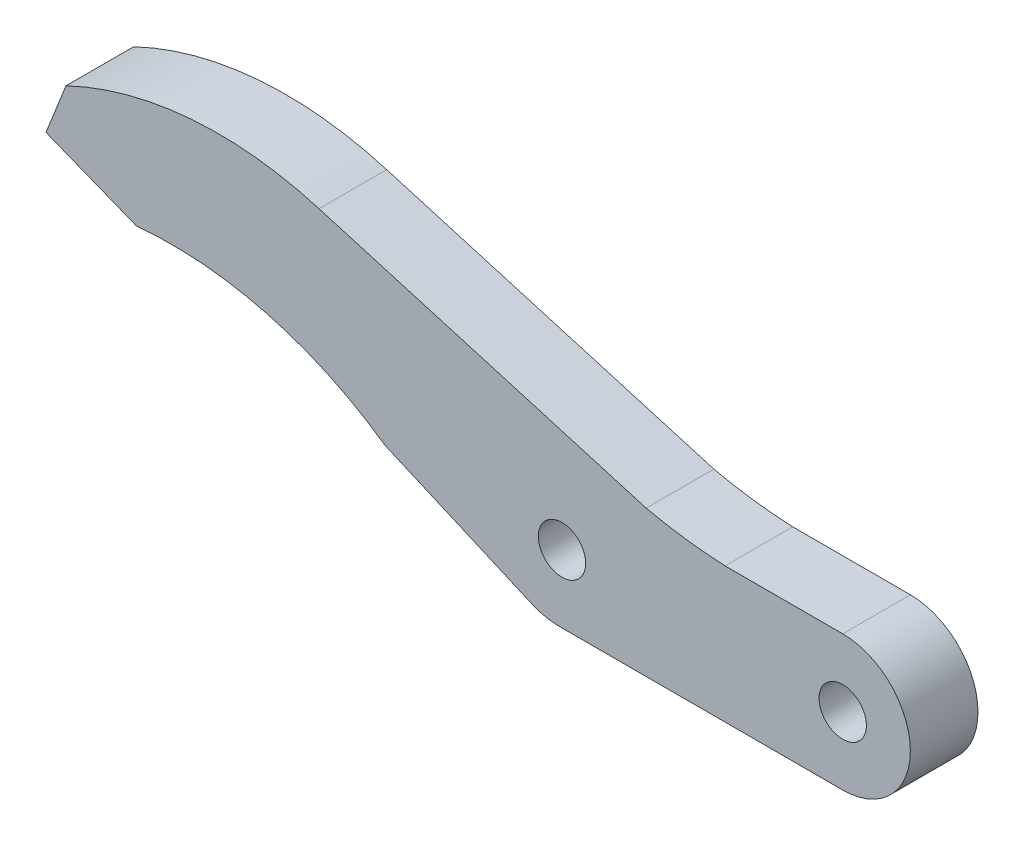
ISO-10303-21;
HEADER;
FILE_DESCRIPTION(('STEP AP214'),'2;1');
FILE_NAME('part.step','',(''),(''),'','','');
FILE_SCHEMA(('AUTOMOTIVE_DESIGN { 1 0 10303 214 1 1 1 1 }'));
ENDSEC;
DATA;
#1=APPLICATION_CONTEXT('core data for automotive mechanical design processes');
#2=APPLICATION_PROTOCOL_DEFINITION('international standard','automotive_design',2000,#1);
#3=PRODUCT_CONTEXT('',#1,'mechanical');
#4=PRODUCT('Part','Part','',(#3));
#5=PRODUCT_RELATED_PRODUCT_CATEGORY('part','',(#4));
#6=PRODUCT_DEFINITION_FORMATION('','',#4);
#7=PRODUCT_DEFINITION_CONTEXT('part definition',#1,'design');
#8=PRODUCT_DEFINITION('design','',#6,#7);
#9=PRODUCT_DEFINITION_SHAPE('','',#8);
#10=(LENGTH_UNIT() NAMED_UNIT(*) SI_UNIT(.MILLI.,.METRE.));
#11=(NAMED_UNIT(*) PLANE_ANGLE_UNIT() SI_UNIT($,.RADIAN.));
#12=(NAMED_UNIT(*) SI_UNIT($,.STERADIAN.) SOLID_ANGLE_UNIT());
#13=UNCERTAINTY_MEASURE_WITH_UNIT(LENGTH_MEASURE(1.E-05),#10,'distance_accuracy_value','');
#14=(GEOMETRIC_REPRESENTATION_CONTEXT(3) GLOBAL_UNCERTAINTY_ASSIGNED_CONTEXT((#13)) GLOBAL_UNIT_ASSIGNED_CONTEXT((#10,
#11,#12)) REPRESENTATION_CONTEXT('',''));
#15=CARTESIAN_POINT('',(0.,0.,0.));
#16=DIRECTION('',(0.,0.,1.));
#17=DIRECTION('',(1.,0.,0.));
#18=AXIS2_PLACEMENT_3D('',#15,#16,#17);
#19=CARTESIAN_POINT('',(-49.5655009596438,-22.2319264601483,5.));
#20=DIRECTION('',(0.,0.,1.));
#21=DIRECTION('',(1.,0.,0.));
#22=AXIS2_PLACEMENT_3D('',#19,#20,#21);
#23=PLANE('',#22);
#24=CARTESIAN_POINT('',(0.,0.,5.));
#25=DIRECTION('',(0.,0.,1.));
#26=DIRECTION('',(1.,0.,0.));
#27=AXIS2_PLACEMENT_3D('',#24,#25,#26);
#28=CIRCLE('',#27,1.74998529864571);
#29=CARTESIAN_POINT('',(1.74998529864571,0.,5.));
#30=VERTEX_POINT('',#29);
#31=EDGE_CURVE('E185',#30,#30,#28,.T.);
#32=ORIENTED_EDGE('',*,*,#31,.F.);
#33=EDGE_LOOP('',(#32));
#34=FACE_BOUND('',#33,.T.);
#35=DIRECTION('',(0.916929046835155,-0.399050276368749,0.));
#36=VECTOR('',#35,1.);
#37=CARTESIAN_POINT('',(-33.8283838458603,0.147779707769994,5.));
#38=LINE('',#37,#36);
#39=CARTESIAN_POINT('',(-33.8283838458603,0.147779707769994,5.));
#40=VERTEX_POINT('',#39);
#41=CARTESIAN_POINT('',(-22.9543922898167,-4.58461409156264,5.));
#42=VERTEX_POINT('',#41);
#43=EDGE_CURVE('E115',#40,#42,#38,.T.);
#44=ORIENTED_EDGE('',*,*,#43,.T.);
#45=CARTESIAN_POINT('',(-20.9591409079729,3.11426131299659E-05,5.));
#46=DIRECTION('',(0.,0.,1.));
#47=DIRECTION('',(1.,0.,0.));
#48=AXIS2_PLACEMENT_3D('',#45,#46,#47);
#49=CIRCLE('',#48,5.);
#50=CARTESIAN_POINT('',(-20.9591409079729,-4.99996885738687,5.));
#51=VERTEX_POINT('',#50);
#52=EDGE_CURVE('E11',#42,#51,#49,.T.);
#53=ORIENTED_EDGE('',*,*,#52,.T.);
#54=DIRECTION('',(1.,0.,0.));
#55=VECTOR('',#54,1.);
#56=CARTESIAN_POINT('',(0.,-4.99996885738687,5.));
#57=LINE('',#56,#55);
#58=CARTESIAN_POINT('',(0.,-4.99996885738687,5.));
#59=VERTEX_POINT('',#58);
#60=EDGE_CURVE('E123',#51,#59,#57,.T.);
#61=ORIENTED_EDGE('',*,*,#60,.T.);
#62=CARTESIAN_POINT('',(0.,0.,5.));
#63=DIRECTION('',(0.,0.,1.));
#64=DIRECTION('',(1.,0.,0.));
#65=AXIS2_PLACEMENT_3D('',#62,#63,#64);
#66=CIRCLE('',#65,4.99996885738686);
#67=CARTESIAN_POINT('',(0.,4.99996885738686,5.));
#68=VERTEX_POINT('',#67);
#69=EDGE_CURVE('E197',#59,#68,#66,.T.);
#70=ORIENTED_EDGE('',*,*,#69,.T.);
#71=DIRECTION('',(-1.,0.,0.));
#72=VECTOR('',#71,1.);
#73=CARTESIAN_POINT('',(0.,4.99996885738686,5.));
#74=LINE('',#73,#72);
#75=CARTESIAN_POINT('',(-8.7,4.99996885738686,5.));
#76=VERTEX_POINT('',#75);
#77=EDGE_CURVE('E195',#68,#76,#74,.T.);
#78=ORIENTED_EDGE('',*,*,#77,.T.);
#79=CARTESIAN_POINT('',(-7.15261933154449,38.5643191872665,5.));
#80=DIRECTION('',(0.,0.,-1.));
#81=DIRECTION('',(-1.,0.,0.));
#82=AXIS2_PLACEMENT_3D('',#79,#80,#81);
#83=CIRCLE('',#82,33.6);
#84=CARTESIAN_POINT('',(-14.5233264252033,5.78272866850905,5.));
#85=VERTEX_POINT('',#84);
#86=EDGE_CURVE('E193',#76,#85,#83,.T.);
#87=ORIENTED_EDGE('',*,*,#86,.T.);
#88=DIRECTION('',(-0.959759160307781,0.280824418819489,0.));
#89=VECTOR('',#88,1.);
#90=CARTESIAN_POINT('',(-38.7092572649595,12.8595040227602,5.));
#91=LINE('',#90,#89);
#92=CARTESIAN_POINT('',(-38.7092572649595,12.8595040227602,5.));
#93=VERTEX_POINT('',#92);
#94=EDGE_CURVE('E191',#85,#93,#91,.T.);
#95=ORIENTED_EDGE('',*,*,#94,.T.);
#96=CARTESIAN_POINT('',(-46.1413277586198,-12.0556385250412,5.));
#97=DIRECTION('',(0.,0.,1.));
#98=DIRECTION('',(1.,0.,0.));
#99=AXIS2_PLACEMENT_3D('',#96,#97,#98);
#100=CIRCLE('',#99,26.);
#101=CARTESIAN_POINT('',(-57.4174023013608,11.3719124119763,5.));
#102=VERTEX_POINT('',#101);
#103=EDGE_CURVE('E189',#93,#102,#100,.T.);
#104=ORIENTED_EDGE('',*,*,#103,.T.);
#105=DIRECTION('',(-0.368541423081734,-0.929611327100144,0.));
#106=VECTOR('',#105,1.);
#107=CARTESIAN_POINT('',(-58.8915679936878,7.65346710357549,5.));
#108=LINE('',#107,#106);
#109=CARTESIAN_POINT('',(-58.8915679936878,7.65346710357549,5.));
#110=VERTEX_POINT('',#109);
#111=EDGE_CURVE('E187',#102,#110,#108,.T.);
#112=ORIENTED_EDGE('',*,*,#111,.T.);
#113=DIRECTION('',(0.929611327100136,-0.368541423081754,0.));
#114=VECTOR('',#113,1.);
#115=CARTESIAN_POINT('',(-52.1983664385668,4.99996885738686,5.));
#116=LINE('',#115,#114);
#117=CARTESIAN_POINT('',(-52.1983664385668,4.99996885738686,5.));
#118=VERTEX_POINT('',#117);
#119=EDGE_CURVE('E129',#110,#118,#116,.T.);
#120=ORIENTED_EDGE('',*,*,#119,.T.);
#121=CARTESIAN_POINT('',(-49.5655009596438,-22.2319264601483,5.));
#122=DIRECTION('',(0.,0.,-1.));
#123=DIRECTION('',(1.,0.,0.));
#124=AXIS2_PLACEMENT_3D('',#121,#122,#123);
#125=CIRCLE('',#124,27.3588761321678);
#126=EDGE_CURVE('E124',#118,#40,#125,.T.);
#127=ORIENTED_EDGE('',*,*,#126,.T.);
#128=EDGE_LOOP('',(#44,#53,#61,#70,#78,#87,#95,#104,#112,#120,#127));
#129=FACE_BOUND('',#128,.T.);
#130=CARTESIAN_POINT('',(-20.75,0.,5.));
#131=DIRECTION('',(0.,0.,1.));
#132=DIRECTION('',(1.,0.,0.));
#133=AXIS2_PLACEMENT_3D('',#130,#131,#132);
#134=CIRCLE('',#133,1.75);
#135=CARTESIAN_POINT('',(-19.,0.,5.));
#136=VERTEX_POINT('',#135);
#137=EDGE_CURVE('E203',#136,#136,#134,.T.);
#138=ORIENTED_EDGE('',*,*,#137,.F.);
#139=EDGE_LOOP('',(#138));
#140=FACE_BOUND('',#139,.T.);
#141=ADVANCED_FACE('F36',(#34,#129,#140),#23,.T.);
#142=CARTESIAN_POINT('',(-49.5655009596438,-22.2319264601483,0.));
#143=DIRECTION('',(0.,0.,1.));
#144=DIRECTION('',(1.,0.,0.));
#145=AXIS2_PLACEMENT_3D('',#142,#143,#144);
#146=PLANE('',#145);
#147=DIRECTION('',(1.,0.,0.));
#148=VECTOR('',#147,1.);
#149=CARTESIAN_POINT('',(0.,-4.99996885738687,0.));
#150=LINE('',#149,#148);
#151=CARTESIAN_POINT('',(-20.9591409079729,-4.99996885738687,0.));
#152=VERTEX_POINT('',#151);
#153=CARTESIAN_POINT('',(0.,-4.99996885738687,0.));
#154=VERTEX_POINT('',#153);
#155=EDGE_CURVE('E180',#152,#154,#150,.T.);
#156=ORIENTED_EDGE('',*,*,#155,.F.);
#157=CARTESIAN_POINT('',(-20.9591409079729,3.11426131299659E-05,0.));
#158=DIRECTION('',(0.,0.,1.));
#159=DIRECTION('',(1.,0.,0.));
#160=AXIS2_PLACEMENT_3D('',#157,#158,#159);
#161=CIRCLE('',#160,5.);
#162=CARTESIAN_POINT('',(-22.9543922898167,-4.58461409156264,0.));
#163=VERTEX_POINT('',#162);
#164=EDGE_CURVE('E58',#152,#163,#161,.F.);
#165=ORIENTED_EDGE('',*,*,#164,.T.);
#166=DIRECTION('',(0.916929046835155,-0.399050276368749,0.));
#167=VECTOR('',#166,1.);
#168=CARTESIAN_POINT('',(-33.8283838458603,0.147779707769994,0.));
#169=LINE('',#168,#167);
#170=CARTESIAN_POINT('',(-33.8283838458603,0.147779707769994,0.));
#171=VERTEX_POINT('',#170);
#172=EDGE_CURVE('E182',#171,#163,#169,.T.);
#173=ORIENTED_EDGE('',*,*,#172,.F.);
#174=CARTESIAN_POINT('',(-49.5655009596438,-22.2319264601483,0.));
#175=DIRECTION('',(0.,0.,-1.));
#176=DIRECTION('',(1.,0.,0.));
#177=AXIS2_PLACEMENT_3D('',#174,#175,#176);
#178=CIRCLE('',#177,27.3588761321678);
#179=CARTESIAN_POINT('',(-52.1983664385668,4.99996885738686,0.));
#180=VERTEX_POINT('',#179);
#181=EDGE_CURVE('E137',#180,#171,#178,.T.);
#182=ORIENTED_EDGE('',*,*,#181,.F.);
#183=DIRECTION('',(0.929611327100136,-0.368541423081754,0.));
#184=VECTOR('',#183,1.);
#185=CARTESIAN_POINT('',(-52.1983664385668,4.99996885738686,0.));
#186=LINE('',#185,#184);
#187=CARTESIAN_POINT('',(-58.8915679936878,7.65346710357549,0.));
#188=VERTEX_POINT('',#187);
#189=EDGE_CURVE('E133',#188,#180,#186,.T.);
#190=ORIENTED_EDGE('',*,*,#189,.F.);
#191=DIRECTION('',(-0.368541423081734,-0.929611327100144,0.));
#192=VECTOR('',#191,1.);
#193=CARTESIAN_POINT('',(-58.8915679936878,7.65346710357549,0.));
#194=LINE('',#193,#192);
#195=CARTESIAN_POINT('',(-57.4174023013608,11.3719124119763,0.));
#196=VERTEX_POINT('',#195);
#197=EDGE_CURVE('E168',#196,#188,#194,.T.);
#198=ORIENTED_EDGE('',*,*,#197,.F.);
#199=CARTESIAN_POINT('',(-46.1413277586198,-12.0556385250412,0.));
#200=DIRECTION('',(0.,0.,1.));
#201=DIRECTION('',(1.,0.,0.));
#202=AXIS2_PLACEMENT_3D('',#199,#200,#201);
#203=CIRCLE('',#202,26.);
#204=CARTESIAN_POINT('',(-38.7092572649595,12.8595040227602,0.));
#205=VERTEX_POINT('',#204);
#206=EDGE_CURVE('E170',#205,#196,#203,.T.);
#207=ORIENTED_EDGE('',*,*,#206,.F.);
#208=DIRECTION('',(-0.959759160307781,0.280824418819489,0.));
#209=VECTOR('',#208,1.);
#210=CARTESIAN_POINT('',(-38.7092572649595,12.8595040227602,0.));
#211=LINE('',#210,#209);
#212=CARTESIAN_POINT('',(-14.5233264252033,5.78272866850905,0.));
#213=VERTEX_POINT('',#212);
#214=EDGE_CURVE('E172',#213,#205,#211,.T.);
#215=ORIENTED_EDGE('',*,*,#214,.F.);
#216=CARTESIAN_POINT('',(-7.15261933154449,38.5643191872665,0.));
#217=DIRECTION('',(0.,0.,-1.));
#218=DIRECTION('',(-1.,0.,0.));
#219=AXIS2_PLACEMENT_3D('',#216,#217,#218);
#220=CIRCLE('',#219,33.6);
#221=CARTESIAN_POINT('',(-8.7,4.99996885738686,0.));
#222=VERTEX_POINT('',#221);
#223=EDGE_CURVE('E174',#222,#213,#220,.T.);
#224=ORIENTED_EDGE('',*,*,#223,.F.);
#225=DIRECTION('',(-1.,0.,0.));
#226=VECTOR('',#225,1.);
#227=CARTESIAN_POINT('',(0.,4.99996885738686,0.));
#228=LINE('',#227,#226);
#229=CARTESIAN_POINT('',(0.,4.99996885738686,0.));
#230=VERTEX_POINT('',#229);
#231=EDGE_CURVE('E176',#230,#222,#228,.T.);
#232=ORIENTED_EDGE('',*,*,#231,.F.);
#233=CARTESIAN_POINT('',(0.,0.,0.));
#234=DIRECTION('',(0.,0.,1.));
#235=DIRECTION('',(1.,0.,0.));
#236=AXIS2_PLACEMENT_3D('',#233,#234,#235);
#237=CIRCLE('',#236,4.99996885738686);
#238=EDGE_CURVE('E178',#154,#230,#237,.T.);
#239=ORIENTED_EDGE('',*,*,#238,.F.);
#240=EDGE_LOOP('',(#156,#165,#173,#182,#190,#198,#207,#215,#224,#232,#239));
#241=FACE_BOUND('',#240,.T.);
#242=CARTESIAN_POINT('',(0.,0.,0.));
#243=DIRECTION('',(0.,0.,1.));
#244=DIRECTION('',(1.,0.,0.));
#245=AXIS2_PLACEMENT_3D('',#242,#243,#244);
#246=CIRCLE('',#245,1.74998529864571);
#247=CARTESIAN_POINT('',(1.74998529864571,0.,0.));
#248=VERTEX_POINT('',#247);
#249=EDGE_CURVE('E200',#248,#248,#246,.T.);
#250=ORIENTED_EDGE('',*,*,#249,.T.);
#251=EDGE_LOOP('',(#250));
#252=FACE_BOUND('',#251,.T.);
#253=CARTESIAN_POINT('',(-20.75,0.,0.));
#254=DIRECTION('',(0.,0.,1.));
#255=DIRECTION('',(1.,0.,0.));
#256=AXIS2_PLACEMENT_3D('',#253,#254,#255);
#257=CIRCLE('',#256,1.75);
#258=CARTESIAN_POINT('',(-19.,0.,0.));
#259=VERTEX_POINT('',#258);
#260=EDGE_CURVE('E206',#259,#259,#257,.T.);
#261=ORIENTED_EDGE('',*,*,#260,.T.);
#262=EDGE_LOOP('',(#261));
#263=FACE_BOUND('',#262,.T.);
#264=ADVANCED_FACE('F215',(#241,#252,#263),#146,.F.);
#265=CARTESIAN_POINT('',(-49.5655009596438,-22.2319264601483,5.));
#266=DIRECTION('',(0.,0.,-1.));
#267=DIRECTION('',(-1.,0.,0.));
#268=AXIS2_PLACEMENT_3D('',#265,#266,#267);
#269=CYLINDRICAL_SURFACE('',#268,27.3588761321678);
#270=ORIENTED_EDGE('',*,*,#181,.T.);
#271=DIRECTION('',(0.,0.,-1.));
#272=VECTOR('',#271,1.);
#273=CARTESIAN_POINT('',(-33.8283838458603,0.147779707769994,5.));
#274=LINE('',#273,#272);
#275=EDGE_CURVE('E119',#40,#171,#274,.T.);
#276=ORIENTED_EDGE('',*,*,#275,.F.);
#277=ORIENTED_EDGE('',*,*,#126,.F.);
#278=DIRECTION('',(0.,0.,-1.));
#279=VECTOR('',#278,1.);
#280=CARTESIAN_POINT('',(-52.1983664385668,4.99996885738686,5.));
#281=LINE('',#280,#279);
#282=EDGE_CURVE('E165',#118,#180,#281,.T.);
#283=ORIENTED_EDGE('',*,*,#282,.T.);
#284=EDGE_LOOP('',(#270,#276,#277,#283));
#285=FACE_BOUND('',#284,.T.);
#286=ADVANCED_FACE('F135',(#285),#269,.F.);
#287=CARTESIAN_POINT('',(-33.8283838458603,0.147779707769994,5.));
#288=DIRECTION('',(0.399050276368749,0.916929046835155,0.));
#289=DIRECTION('',(-0.916929046835155,0.399050276368749,0.));
#290=AXIS2_PLACEMENT_3D('',#287,#288,#289);
#291=PLANE('',#290);
#292=ORIENTED_EDGE('',*,*,#172,.T.);
#293=DIRECTION('',(0.,0.,-1.));
#294=VECTOR('',#293,1.);
#295=CARTESIAN_POINT('',(-22.9543922898167,-4.58461409156264,5.));
#296=LINE('',#295,#294);
#297=EDGE_CURVE('E44',#163,#42,#296,.F.);
#298=ORIENTED_EDGE('',*,*,#297,.T.);
#299=ORIENTED_EDGE('',*,*,#43,.F.);
#300=ORIENTED_EDGE('',*,*,#275,.T.);
#301=EDGE_LOOP('',(#292,#298,#299,#300));
#302=FACE_BOUND('',#301,.T.);
#303=ADVANCED_FACE('F117',(#302),#291,.F.);
#304=CARTESIAN_POINT('',(0.,-4.99996885738687,5.));
#305=DIRECTION('',(0.,1.,0.));
#306=DIRECTION('',(-1.,0.,0.));
#307=AXIS2_PLACEMENT_3D('',#304,#305,#306);
#308=PLANE('',#307);
#309=ORIENTED_EDGE('',*,*,#60,.F.);
#310=DIRECTION('',(0.,0.,-1.));
#311=VECTOR('',#310,1.);
#312=CARTESIAN_POINT('',(-20.9591409079729,-4.99996885738687,5.));
#313=LINE('',#312,#311);
#314=EDGE_CURVE('E138',#51,#152,#313,.T.);
#315=ORIENTED_EDGE('',*,*,#314,.T.);
#316=ORIENTED_EDGE('',*,*,#155,.T.);
#317=DIRECTION('',(0.,0.,-1.));
#318=VECTOR('',#317,1.);
#319=CARTESIAN_POINT('',(0.,-4.99996885738687,5.));
#320=LINE('',#319,#318);
#321=EDGE_CURVE('E139',#59,#154,#320,.T.);
#322=ORIENTED_EDGE('',*,*,#321,.F.);
#323=EDGE_LOOP('',(#309,#315,#316,#322));
#324=FACE_BOUND('',#323,.T.);
#325=ADVANCED_FACE('F254',(#324),#308,.F.);
#326=CARTESIAN_POINT('',(0.,0.,5.));
#327=DIRECTION('',(0.,0.,-1.));
#328=DIRECTION('',(-1.,0.,0.));
#329=AXIS2_PLACEMENT_3D('',#326,#327,#328);
#330=CYLINDRICAL_SURFACE('',#329,4.99996885738686);
#331=ORIENTED_EDGE('',*,*,#238,.T.);
#332=DIRECTION('',(0.,0.,-1.));
#333=VECTOR('',#332,1.);
#334=CARTESIAN_POINT('',(0.,4.99996885738686,5.));
#335=LINE('',#334,#333);
#336=EDGE_CURVE('E144',#68,#230,#335,.T.);
#337=ORIENTED_EDGE('',*,*,#336,.F.);
#338=ORIENTED_EDGE('',*,*,#69,.F.);
#339=ORIENTED_EDGE('',*,*,#321,.T.);
#340=EDGE_LOOP('',(#331,#337,#338,#339));
#341=FACE_BOUND('',#340,.T.);
#342=ADVANCED_FACE('F250',(#341),#330,.T.);
#343=CARTESIAN_POINT('',(0.,4.99996885738686,5.));
#344=DIRECTION('',(0.,-1.,0.));
#345=DIRECTION('',(1.,0.,0.));
#346=AXIS2_PLACEMENT_3D('',#343,#344,#345);
#347=PLANE('',#346);
#348=ORIENTED_EDGE('',*,*,#231,.T.);
#349=DIRECTION('',(0.,0.,-1.));
#350=VECTOR('',#349,1.);
#351=CARTESIAN_POINT('',(-8.7,4.99996885738686,5.));
#352=LINE('',#351,#350);
#353=EDGE_CURVE('E150',#76,#222,#352,.T.);
#354=ORIENTED_EDGE('',*,*,#353,.F.);
#355=ORIENTED_EDGE('',*,*,#77,.F.);
#356=ORIENTED_EDGE('',*,*,#336,.T.);
#357=EDGE_LOOP('',(#348,#354,#355,#356));
#358=FACE_BOUND('',#357,.T.);
#359=ADVANCED_FACE('F246',(#358),#347,.F.);
#360=CARTESIAN_POINT('',(-7.15261933154449,38.5643191872665,5.));
#361=DIRECTION('',(0.,0.,-1.));
#362=DIRECTION('',(-1.,0.,0.));
#363=AXIS2_PLACEMENT_3D('',#360,#361,#362);
#364=CYLINDRICAL_SURFACE('',#363,33.6);
#365=ORIENTED_EDGE('',*,*,#223,.T.);
#366=DIRECTION('',(0.,0.,-1.));
#367=VECTOR('',#366,1.);
#368=CARTESIAN_POINT('',(-14.5233264252033,5.78272866850905,5.));
#369=LINE('',#368,#367);
#370=EDGE_CURVE('E153',#85,#213,#369,.T.);
#371=ORIENTED_EDGE('',*,*,#370,.F.);
#372=ORIENTED_EDGE('',*,*,#86,.F.);
#373=ORIENTED_EDGE('',*,*,#353,.T.);
#374=EDGE_LOOP('',(#365,#371,#372,#373));
#375=FACE_BOUND('',#374,.T.);
#376=ADVANCED_FACE('F242',(#375),#364,.F.);
#377=CARTESIAN_POINT('',(-38.7092572649595,12.8595040227602,5.));
#378=DIRECTION('',(-0.280824418819489,-0.959759160307781,0.));
#379=DIRECTION('',(0.959759160307781,-0.280824418819489,0.));
#380=AXIS2_PLACEMENT_3D('',#377,#378,#379);
#381=PLANE('',#380);
#382=ORIENTED_EDGE('',*,*,#214,.T.);
#383=DIRECTION('',(0.,0.,-1.));
#384=VECTOR('',#383,1.);
#385=CARTESIAN_POINT('',(-38.7092572649595,12.8595040227602,5.));
#386=LINE('',#385,#384);
#387=EDGE_CURVE('E156',#93,#205,#386,.T.);
#388=ORIENTED_EDGE('',*,*,#387,.F.);
#389=ORIENTED_EDGE('',*,*,#94,.F.);
#390=ORIENTED_EDGE('',*,*,#370,.T.);
#391=EDGE_LOOP('',(#382,#388,#389,#390));
#392=FACE_BOUND('',#391,.T.);
#393=ADVANCED_FACE('F238',(#392),#381,.F.);
#394=CARTESIAN_POINT('',(-46.1413277586198,-12.0556385250412,5.));
#395=DIRECTION('',(0.,0.,-1.));
#396=DIRECTION('',(-1.,0.,0.));
#397=AXIS2_PLACEMENT_3D('',#394,#395,#396);
#398=CYLINDRICAL_SURFACE('',#397,26.);
#399=ORIENTED_EDGE('',*,*,#206,.T.);
#400=DIRECTION('',(0.,0.,-1.));
#401=VECTOR('',#400,1.);
#402=CARTESIAN_POINT('',(-57.4174023013608,11.3719124119763,5.));
#403=LINE('',#402,#401);
#404=EDGE_CURVE('E159',#102,#196,#403,.T.);
#405=ORIENTED_EDGE('',*,*,#404,.F.);
#406=ORIENTED_EDGE('',*,*,#103,.F.);
#407=ORIENTED_EDGE('',*,*,#387,.T.);
#408=EDGE_LOOP('',(#399,#405,#406,#407));
#409=FACE_BOUND('',#408,.T.);
#410=ADVANCED_FACE('F234',(#409),#398,.T.);
#411=CARTESIAN_POINT('',(-58.8915679936878,7.65346710357549,5.));
#412=DIRECTION('',(0.929611327100144,-0.368541423081734,0.));
#413=DIRECTION('',(0.368541423081734,0.929611327100144,0.));
#414=AXIS2_PLACEMENT_3D('',#411,#412,#413);
#415=PLANE('',#414);
#416=ORIENTED_EDGE('',*,*,#197,.T.);
#417=DIRECTION('',(0.,0.,-1.));
#418=VECTOR('',#417,1.);
#419=CARTESIAN_POINT('',(-58.8915679936878,7.65346710357549,5.));
#420=LINE('',#419,#418);
#421=EDGE_CURVE('E162',#110,#188,#420,.T.);
#422=ORIENTED_EDGE('',*,*,#421,.F.);
#423=ORIENTED_EDGE('',*,*,#111,.F.);
#424=ORIENTED_EDGE('',*,*,#404,.T.);
#425=EDGE_LOOP('',(#416,#422,#423,#424));
#426=FACE_BOUND('',#425,.T.);
#427=ADVANCED_FACE('F230',(#426),#415,.F.);
#428=CARTESIAN_POINT('',(-52.1983664385668,4.99996885738686,5.));
#429=DIRECTION('',(0.368541423081754,0.929611327100136,0.));
#430=DIRECTION('',(-0.929611327100136,0.368541423081754,0.));
#431=AXIS2_PLACEMENT_3D('',#428,#429,#430);
#432=PLANE('',#431);
#433=ORIENTED_EDGE('',*,*,#189,.T.);
#434=ORIENTED_EDGE('',*,*,#282,.F.);
#435=ORIENTED_EDGE('',*,*,#119,.F.);
#436=ORIENTED_EDGE('',*,*,#421,.T.);
#437=EDGE_LOOP('',(#433,#434,#435,#436));
#438=FACE_BOUND('',#437,.T.);
#439=ADVANCED_FACE('F227',(#438),#432,.F.);
#440=CARTESIAN_POINT('',(0.,0.,5.));
#441=DIRECTION('',(0.,0.,-1.));
#442=DIRECTION('',(-1.,0.,0.));
#443=AXIS2_PLACEMENT_3D('',#440,#441,#442);
#444=CYLINDRICAL_SURFACE('',#443,1.74998529864571);
#445=ORIENTED_EDGE('',*,*,#31,.T.);
#446=EDGE_LOOP('',(#445));
#447=FACE_BOUND('',#446,.T.);
#448=ORIENTED_EDGE('',*,*,#249,.F.);
#449=EDGE_LOOP('',(#448));
#450=FACE_BOUND('',#449,.T.);
#451=ADVANCED_FACE('F224',(#447,#450),#444,.F.);
#452=CARTESIAN_POINT('',(-20.75,0.,5.));
#453=DIRECTION('',(0.,0.,-1.));
#454=DIRECTION('',(-1.,0.,0.));
#455=AXIS2_PLACEMENT_3D('',#452,#453,#454);
#456=CYLINDRICAL_SURFACE('',#455,1.75);
#457=ORIENTED_EDGE('',*,*,#137,.T.);
#458=EDGE_LOOP('',(#457));
#459=FACE_BOUND('',#458,.T.);
#460=ORIENTED_EDGE('',*,*,#260,.F.);
#461=EDGE_LOOP('',(#460));
#462=FACE_BOUND('',#461,.T.);
#463=ADVANCED_FACE('F212',(#459,#462),#456,.F.);
#464=CARTESIAN_POINT('',(-20.9591409079729,3.11426131299659E-05,5.));
#465=DIRECTION('',(0.,0.,-1.));
#466=DIRECTION('',(-1.,0.,0.));
#467=AXIS2_PLACEMENT_3D('',#464,#465,#466);
#468=CYLINDRICAL_SURFACE('',#467,5.);
#469=ORIENTED_EDGE('',*,*,#52,.F.);
#470=ORIENTED_EDGE('',*,*,#297,.F.);
#471=ORIENTED_EDGE('',*,*,#164,.F.);
#472=ORIENTED_EDGE('',*,*,#314,.F.);
#473=EDGE_LOOP('',(#469,#470,#471,#472));
#474=FACE_BOUND('',#473,.T.);
#475=ADVANCED_FACE('F38',(#474),#468,.T.);
#476=CLOSED_SHELL('',(#141,#264,#286,#303,#325,#342,#359,#376,#393,#410,#427,#439,#451,#463,#475));
#477=MANIFOLD_SOLID_BREP('B2',#476);
#478=ADVANCED_BREP_SHAPE_REPRESENTATION('',(#18,#477),#14);
#479=SHAPE_DEFINITION_REPRESENTATION(#9,#478);
ENDSEC;
END-ISO-10303-21;
